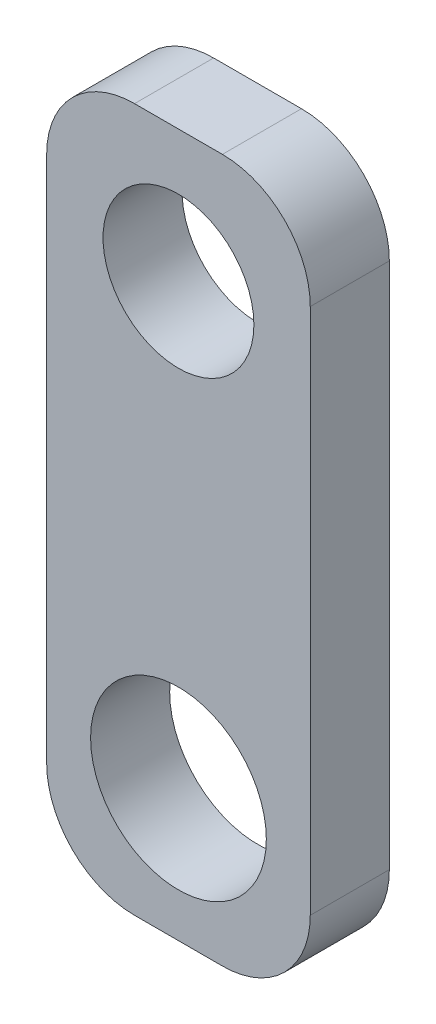
ISO-10303-21;
HEADER;
FILE_DESCRIPTION(('STEP AP214'),'2;1');
FILE_NAME('part.step','',(''),(''),'','','');
FILE_SCHEMA(('AUTOMOTIVE_DESIGN { 1 0 10303 214 1 1 1 1 }'));
ENDSEC;
DATA;
#1=APPLICATION_CONTEXT('core data for automotive mechanical design processes');
#2=APPLICATION_PROTOCOL_DEFINITION('international standard','automotive_design',2000,#1);
#3=PRODUCT_CONTEXT('',#1,'mechanical');
#4=PRODUCT('Part','Part','',(#3));
#5=PRODUCT_RELATED_PRODUCT_CATEGORY('part','',(#4));
#6=PRODUCT_DEFINITION_FORMATION('','',#4);
#7=PRODUCT_DEFINITION_CONTEXT('part definition',#1,'design');
#8=PRODUCT_DEFINITION('design','',#6,#7);
#9=PRODUCT_DEFINITION_SHAPE('','',#8);
#10=(LENGTH_UNIT() NAMED_UNIT(*) SI_UNIT(.MILLI.,.METRE.));
#11=(NAMED_UNIT(*) PLANE_ANGLE_UNIT() SI_UNIT($,.RADIAN.));
#12=(NAMED_UNIT(*) SI_UNIT($,.STERADIAN.) SOLID_ANGLE_UNIT());
#13=UNCERTAINTY_MEASURE_WITH_UNIT(LENGTH_MEASURE(1.E-05),#10,'distance_accuracy_value','');
#14=(GEOMETRIC_REPRESENTATION_CONTEXT(3) GLOBAL_UNCERTAINTY_ASSIGNED_CONTEXT((#13)) GLOBAL_UNIT_ASSIGNED_CONTEXT((#10,
#11,#12)) REPRESENTATION_CONTEXT('',''));
#15=CARTESIAN_POINT('',(0.,0.,0.));
#16=DIRECTION('',(0.,0.,1.));
#17=DIRECTION('',(1.,0.,0.));
#18=AXIS2_PLACEMENT_3D('',#15,#16,#17);
#19=CARTESIAN_POINT('',(12.7,12.7,11.43));
#20=DIRECTION('',(0.,0.,-1.));
#21=DIRECTION('',(-1.,0.,0.));
#22=AXIS2_PLACEMENT_3D('',#19,#20,#21);
#23=PLANE('',#22);
#24=CARTESIAN_POINT('',(12.7,12.7,11.43));
#25=DIRECTION('',(0.,0.,1.));
#26=DIRECTION('',(-1.,0.,0.));
#27=AXIS2_PLACEMENT_3D('',#24,#25,#26);
#28=CIRCLE('',#27,12.7);
#29=CARTESIAN_POINT('',(0.,12.7000000000001,11.43));
#30=VERTEX_POINT('',#29);
#31=CARTESIAN_POINT('',(12.7000000000001,0.,11.43));
#32=VERTEX_POINT('',#31);
#33=EDGE_CURVE('E154',#30,#32,#28,.T.);
#34=ORIENTED_EDGE('',*,*,#33,.T.);
#35=DIRECTION('',(1.,0.,0.));
#36=VECTOR('',#35,1.);
#37=CARTESIAN_POINT('',(12.7000000000001,0.,11.43));
#38=LINE('',#37,#36);
#39=CARTESIAN_POINT('',(25.3999999999999,0.,11.43));
#40=VERTEX_POINT('',#39);
#41=EDGE_CURVE('E104',#32,#40,#38,.T.);
#42=ORIENTED_EDGE('',*,*,#41,.T.);
#43=CARTESIAN_POINT('',(25.4,12.7,11.43));
#44=DIRECTION('',(0.,0.,1.));
#45=DIRECTION('',(1.,0.,0.));
#46=AXIS2_PLACEMENT_3D('',#43,#44,#45);
#47=CIRCLE('',#46,12.7);
#48=CARTESIAN_POINT('',(38.1,12.7,11.43));
#49=VERTEX_POINT('',#48);
#50=EDGE_CURVE('E169',#40,#49,#47,.T.);
#51=ORIENTED_EDGE('',*,*,#50,.T.);
#52=DIRECTION('',(0.,1.,0.));
#53=VECTOR('',#52,1.);
#54=CARTESIAN_POINT('',(38.1,12.7000000000001,11.43));
#55=LINE('',#54,#53);
#56=CARTESIAN_POINT('',(38.1,88.8999999999999,11.43));
#57=VERTEX_POINT('',#56);
#58=EDGE_CURVE('E183',#49,#57,#55,.T.);
#59=ORIENTED_EDGE('',*,*,#58,.T.);
#60=CARTESIAN_POINT('',(25.4,88.9,11.43));
#61=DIRECTION('',(0.,0.,1.));
#62=DIRECTION('',(-1.,0.,0.));
#63=AXIS2_PLACEMENT_3D('',#60,#61,#62);
#64=CIRCLE('',#63,12.7);
#65=CARTESIAN_POINT('',(25.3999999999999,101.6,11.43));
#66=VERTEX_POINT('',#65);
#67=EDGE_CURVE('E122',#57,#66,#64,.T.);
#68=ORIENTED_EDGE('',*,*,#67,.T.);
#69=DIRECTION('',(-1.,0.,0.));
#70=VECTOR('',#69,1.);
#71=CARTESIAN_POINT('',(12.7000000000001,101.6,11.43));
#72=LINE('',#71,#70);
#73=CARTESIAN_POINT('',(12.7000000000001,101.6,11.43));
#74=VERTEX_POINT('',#73);
#75=EDGE_CURVE('E118',#66,#74,#72,.T.);
#76=ORIENTED_EDGE('',*,*,#75,.T.);
#77=CARTESIAN_POINT('',(12.7,88.9,11.43));
#78=DIRECTION('',(0.,0.,1.));
#79=DIRECTION('',(-1.,0.,0.));
#80=AXIS2_PLACEMENT_3D('',#77,#78,#79);
#81=CIRCLE('',#80,12.7);
#82=CARTESIAN_POINT('',(0.,88.8999999999999,11.43));
#83=VERTEX_POINT('',#82);
#84=EDGE_CURVE('E119',#74,#83,#81,.T.);
#85=ORIENTED_EDGE('',*,*,#84,.T.);
#86=DIRECTION('',(0.,-1.,0.));
#87=VECTOR('',#86,1.);
#88=CARTESIAN_POINT('',(0.,12.7000000000001,11.43));
#89=LINE('',#88,#87);
#90=EDGE_CURVE('E58',#83,#30,#89,.T.);
#91=ORIENTED_EDGE('',*,*,#90,.T.);
#92=EDGE_LOOP('',(#34,#42,#51,#59,#68,#76,#85,#91));
#93=FACE_BOUND('',#92,.T.);
#94=CARTESIAN_POINT('',(19.05,82.55,11.43));
#95=DIRECTION('',(0.,0.,1.));
#96=DIRECTION('',(1.,0.,0.));
#97=AXIS2_PLACEMENT_3D('',#94,#95,#96);
#98=CIRCLE('',#97,10.90295);
#99=CARTESIAN_POINT('',(29.95295,82.55,11.43));
#100=VERTEX_POINT('',#99);
#101=EDGE_CURVE('E143',#100,#100,#98,.T.);
#102=ORIENTED_EDGE('',*,*,#101,.F.);
#103=EDGE_LOOP('',(#102));
#104=FACE_BOUND('',#103,.T.);
#105=CARTESIAN_POINT('',(19.05,19.05,11.43));
#106=DIRECTION('',(0.,0.,1.));
#107=DIRECTION('',(1.,0.,0.));
#108=AXIS2_PLACEMENT_3D('',#105,#106,#107);
#109=CIRCLE('',#108,12.7);
#110=CARTESIAN_POINT('',(31.75,19.05,11.43));
#111=VERTEX_POINT('',#110);
#112=EDGE_CURVE('E195',#111,#111,#109,.T.);
#113=ORIENTED_EDGE('',*,*,#112,.F.);
#114=EDGE_LOOP('',(#113));
#115=FACE_BOUND('',#114,.T.);
#116=ADVANCED_FACE('F43',(#93,#104,#115),#23,.F.);
#117=CARTESIAN_POINT('',(12.7,12.7,0.));
#118=DIRECTION('',(0.,0.,-1.));
#119=DIRECTION('',(-1.,0.,0.));
#120=AXIS2_PLACEMENT_3D('',#117,#118,#119);
#121=PLANE('',#120);
#122=CARTESIAN_POINT('',(19.05,82.55,0.));
#123=DIRECTION('',(0.,0.,1.));
#124=DIRECTION('',(1.,0.,0.));
#125=AXIS2_PLACEMENT_3D('',#122,#123,#124);
#126=CIRCLE('',#125,10.90295);
#127=CARTESIAN_POINT('',(29.95295,82.55,0.));
#128=VERTEX_POINT('',#127);
#129=EDGE_CURVE('E188',#128,#128,#126,.T.);
#130=ORIENTED_EDGE('',*,*,#129,.T.);
#131=EDGE_LOOP('',(#130));
#132=FACE_BOUND('',#131,.T.);
#133=CARTESIAN_POINT('',(12.7,12.7,0.));
#134=DIRECTION('',(0.,0.,1.));
#135=DIRECTION('',(-1.,0.,0.));
#136=AXIS2_PLACEMENT_3D('',#133,#134,#135);
#137=CIRCLE('',#136,12.7);
#138=CARTESIAN_POINT('',(0.,12.7000000000001,0.));
#139=VERTEX_POINT('',#138);
#140=CARTESIAN_POINT('',(12.7000000000001,0.,0.));
#141=VERTEX_POINT('',#140);
#142=EDGE_CURVE('E139',#139,#141,#137,.T.);
#143=ORIENTED_EDGE('',*,*,#142,.F.);
#144=DIRECTION('',(0.,-1.,0.));
#145=VECTOR('',#144,1.);
#146=CARTESIAN_POINT('',(0.,12.7000000000001,0.));
#147=LINE('',#146,#145);
#148=CARTESIAN_POINT('',(0.,88.8999999999999,0.));
#149=VERTEX_POINT('',#148);
#150=EDGE_CURVE('E94',#149,#139,#147,.T.);
#151=ORIENTED_EDGE('',*,*,#150,.F.);
#152=CARTESIAN_POINT('',(12.7,88.9,0.));
#153=DIRECTION('',(0.,0.,1.));
#154=DIRECTION('',(-1.,0.,0.));
#155=AXIS2_PLACEMENT_3D('',#152,#153,#154);
#156=CIRCLE('',#155,12.7);
#157=CARTESIAN_POINT('',(12.7000000000001,101.6,0.));
#158=VERTEX_POINT('',#157);
#159=EDGE_CURVE('E87',#158,#149,#156,.T.);
#160=ORIENTED_EDGE('',*,*,#159,.F.);
#161=DIRECTION('',(-1.,0.,0.));
#162=VECTOR('',#161,1.);
#163=CARTESIAN_POINT('',(12.7000000000001,101.6,0.));
#164=LINE('',#163,#162);
#165=CARTESIAN_POINT('',(25.3999999999999,101.6,0.));
#166=VERTEX_POINT('',#165);
#167=EDGE_CURVE('E127',#166,#158,#164,.T.);
#168=ORIENTED_EDGE('',*,*,#167,.F.);
#169=CARTESIAN_POINT('',(25.4,88.9,0.));
#170=DIRECTION('',(0.,0.,1.));
#171=DIRECTION('',(-1.,0.,0.));
#172=AXIS2_PLACEMENT_3D('',#169,#170,#171);
#173=CIRCLE('',#172,12.7);
#174=CARTESIAN_POINT('',(38.1,88.8999999999999,0.));
#175=VERTEX_POINT('',#174);
#176=EDGE_CURVE('E148',#175,#166,#173,.T.);
#177=ORIENTED_EDGE('',*,*,#176,.F.);
#178=DIRECTION('',(0.,1.,0.));
#179=VECTOR('',#178,1.);
#180=CARTESIAN_POINT('',(38.1,12.7000000000001,0.));
#181=LINE('',#180,#179);
#182=CARTESIAN_POINT('',(38.1,12.7,0.));
#183=VERTEX_POINT('',#182);
#184=EDGE_CURVE('E149',#183,#175,#181,.T.);
#185=ORIENTED_EDGE('',*,*,#184,.F.);
#186=CARTESIAN_POINT('',(25.4,12.7,0.));
#187=DIRECTION('',(0.,0.,1.));
#188=DIRECTION('',(1.,0.,0.));
#189=AXIS2_PLACEMENT_3D('',#186,#187,#188);
#190=CIRCLE('',#189,12.7);
#191=CARTESIAN_POINT('',(25.3999999999999,0.,0.));
#192=VERTEX_POINT('',#191);
#193=EDGE_CURVE('E147',#192,#183,#190,.T.);
#194=ORIENTED_EDGE('',*,*,#193,.F.);
#195=DIRECTION('',(1.,0.,0.));
#196=VECTOR('',#195,1.);
#197=CARTESIAN_POINT('',(12.7000000000001,0.,0.));
#198=LINE('',#197,#196);
#199=EDGE_CURVE('E142',#141,#192,#198,.T.);
#200=ORIENTED_EDGE('',*,*,#199,.F.);
#201=EDGE_LOOP('',(#143,#151,#160,#168,#177,#185,#194,#200));
#202=FACE_BOUND('',#201,.T.);
#203=CARTESIAN_POINT('',(19.05,19.05,0.));
#204=DIRECTION('',(0.,0.,1.));
#205=DIRECTION('',(1.,0.,0.));
#206=AXIS2_PLACEMENT_3D('',#203,#204,#205);
#207=CIRCLE('',#206,12.7);
#208=CARTESIAN_POINT('',(31.75,19.05,0.));
#209=VERTEX_POINT('',#208);
#210=EDGE_CURVE('E193',#209,#209,#207,.T.);
#211=ORIENTED_EDGE('',*,*,#210,.T.);
#212=EDGE_LOOP('',(#211));
#213=FACE_BOUND('',#212,.T.);
#214=ADVANCED_FACE('F174',(#132,#202,#213),#121,.T.);
#215=CARTESIAN_POINT('',(12.7,12.7,11.43));
#216=DIRECTION('',(0.,0.,-1.));
#217=DIRECTION('',(-1.,0.,0.));
#218=AXIS2_PLACEMENT_3D('',#215,#216,#217);
#219=CYLINDRICAL_SURFACE('',#218,12.7);
#220=ORIENTED_EDGE('',*,*,#142,.T.);
#221=DIRECTION('',(0.,0.,-1.));
#222=VECTOR('',#221,1.);
#223=CARTESIAN_POINT('',(12.7000000000001,0.,11.43));
#224=LINE('',#223,#222);
#225=EDGE_CURVE('E11',#32,#141,#224,.T.);
#226=ORIENTED_EDGE('',*,*,#225,.F.);
#227=ORIENTED_EDGE('',*,*,#33,.F.);
#228=DIRECTION('',(0.,0.,-1.));
#229=VECTOR('',#228,1.);
#230=CARTESIAN_POINT('',(0.,12.7000000000001,11.43));
#231=LINE('',#230,#229);
#232=EDGE_CURVE('E136',#30,#139,#231,.T.);
#233=ORIENTED_EDGE('',*,*,#232,.T.);
#234=EDGE_LOOP('',(#220,#226,#227,#233));
#235=FACE_BOUND('',#234,.T.);
#236=ADVANCED_FACE('F44',(#235),#219,.T.);
#237=CARTESIAN_POINT('',(12.7000000000001,0.,11.43));
#238=DIRECTION('',(0.,1.,0.));
#239=DIRECTION('',(0.,0.,1.));
#240=AXIS2_PLACEMENT_3D('',#237,#238,#239);
#241=PLANE('',#240);
#242=ORIENTED_EDGE('',*,*,#199,.T.);
#243=DIRECTION('',(0.,0.,-1.));
#244=VECTOR('',#243,1.);
#245=CARTESIAN_POINT('',(25.3999999999999,0.,11.43));
#246=LINE('',#245,#244);
#247=EDGE_CURVE('E55',#40,#192,#246,.T.);
#248=ORIENTED_EDGE('',*,*,#247,.F.);
#249=ORIENTED_EDGE('',*,*,#41,.F.);
#250=ORIENTED_EDGE('',*,*,#225,.T.);
#251=EDGE_LOOP('',(#242,#248,#249,#250));
#252=FACE_BOUND('',#251,.T.);
#253=ADVANCED_FACE('F226',(#252),#241,.F.);
#254=CARTESIAN_POINT('',(25.4,12.7,11.43));
#255=DIRECTION('',(0.,0.,-1.));
#256=DIRECTION('',(-1.,0.,0.));
#257=AXIS2_PLACEMENT_3D('',#254,#255,#256);
#258=CYLINDRICAL_SURFACE('',#257,12.7);
#259=ORIENTED_EDGE('',*,*,#193,.T.);
#260=DIRECTION('',(0.,0.,-1.));
#261=VECTOR('',#260,1.);
#262=CARTESIAN_POINT('',(38.1,12.7,11.43));
#263=LINE('',#262,#261);
#264=EDGE_CURVE('E165',#49,#183,#263,.T.);
#265=ORIENTED_EDGE('',*,*,#264,.F.);
#266=ORIENTED_EDGE('',*,*,#50,.F.);
#267=ORIENTED_EDGE('',*,*,#247,.T.);
#268=EDGE_LOOP('',(#259,#265,#266,#267));
#269=FACE_BOUND('',#268,.T.);
#270=ADVANCED_FACE('F166',(#269),#258,.T.);
#271=CARTESIAN_POINT('',(38.1,12.7000000000001,11.43));
#272=DIRECTION('',(-1.,0.,0.));
#273=DIRECTION('',(0.,-1.,0.));
#274=AXIS2_PLACEMENT_3D('',#271,#272,#273);
#275=PLANE('',#274);
#276=ORIENTED_EDGE('',*,*,#184,.T.);
#277=DIRECTION('',(0.,0.,-1.));
#278=VECTOR('',#277,1.);
#279=CARTESIAN_POINT('',(38.1,88.8999999999999,11.43));
#280=LINE('',#279,#278);
#281=EDGE_CURVE('E159',#57,#175,#280,.T.);
#282=ORIENTED_EDGE('',*,*,#281,.F.);
#283=ORIENTED_EDGE('',*,*,#58,.F.);
#284=ORIENTED_EDGE('',*,*,#264,.T.);
#285=EDGE_LOOP('',(#276,#282,#283,#284));
#286=FACE_BOUND('',#285,.T.);
#287=ADVANCED_FACE('F177',(#286),#275,.F.);
#288=CARTESIAN_POINT('',(25.4,88.9,11.43));
#289=DIRECTION('',(0.,0.,-1.));
#290=DIRECTION('',(-1.,0.,0.));
#291=AXIS2_PLACEMENT_3D('',#288,#289,#290);
#292=CYLINDRICAL_SURFACE('',#291,12.7);
#293=ORIENTED_EDGE('',*,*,#176,.T.);
#294=DIRECTION('',(0.,0.,-1.));
#295=VECTOR('',#294,1.);
#296=CARTESIAN_POINT('',(25.3999999999999,101.6,11.43));
#297=LINE('',#296,#295);
#298=EDGE_CURVE('E131',#66,#166,#297,.T.);
#299=ORIENTED_EDGE('',*,*,#298,.F.);
#300=ORIENTED_EDGE('',*,*,#67,.F.);
#301=ORIENTED_EDGE('',*,*,#281,.T.);
#302=EDGE_LOOP('',(#293,#299,#300,#301));
#303=FACE_BOUND('',#302,.T.);
#304=ADVANCED_FACE('F185',(#303),#292,.T.);
#305=CARTESIAN_POINT('',(12.7000000000001,101.6,11.43));
#306=DIRECTION('',(0.,-1.,0.));
#307=DIRECTION('',(0.,0.,-1.));
#308=AXIS2_PLACEMENT_3D('',#305,#306,#307);
#309=PLANE('',#308);
#310=ORIENTED_EDGE('',*,*,#167,.T.);
#311=DIRECTION('',(0.,0.,-1.));
#312=VECTOR('',#311,1.);
#313=CARTESIAN_POINT('',(12.7000000000001,101.6,11.43));
#314=LINE('',#313,#312);
#315=EDGE_CURVE('E130',#74,#158,#314,.T.);
#316=ORIENTED_EDGE('',*,*,#315,.F.);
#317=ORIENTED_EDGE('',*,*,#75,.F.);
#318=ORIENTED_EDGE('',*,*,#298,.T.);
#319=EDGE_LOOP('',(#310,#316,#317,#318));
#320=FACE_BOUND('',#319,.T.);
#321=ADVANCED_FACE('F126',(#320),#309,.F.);
#322=CARTESIAN_POINT('',(12.7,88.9,11.43));
#323=DIRECTION('',(0.,0.,-1.));
#324=DIRECTION('',(-1.,0.,0.));
#325=AXIS2_PLACEMENT_3D('',#322,#323,#324);
#326=CYLINDRICAL_SURFACE('',#325,12.7);
#327=ORIENTED_EDGE('',*,*,#159,.T.);
#328=DIRECTION('',(0.,0.,-1.));
#329=VECTOR('',#328,1.);
#330=CARTESIAN_POINT('',(0.,88.8999999999999,11.43));
#331=LINE('',#330,#329);
#332=EDGE_CURVE('E135',#83,#149,#331,.T.);
#333=ORIENTED_EDGE('',*,*,#332,.F.);
#334=ORIENTED_EDGE('',*,*,#84,.F.);
#335=ORIENTED_EDGE('',*,*,#315,.T.);
#336=EDGE_LOOP('',(#327,#333,#334,#335));
#337=FACE_BOUND('',#336,.T.);
#338=ADVANCED_FACE('F132',(#337),#326,.T.);
#339=CARTESIAN_POINT('',(0.,12.7000000000001,11.43));
#340=DIRECTION('',(1.,0.,0.));
#341=DIRECTION('',(0.,0.,-1.));
#342=AXIS2_PLACEMENT_3D('',#339,#340,#341);
#343=PLANE('',#342);
#344=ORIENTED_EDGE('',*,*,#150,.T.);
#345=ORIENTED_EDGE('',*,*,#232,.F.);
#346=ORIENTED_EDGE('',*,*,#90,.F.);
#347=ORIENTED_EDGE('',*,*,#332,.T.);
#348=EDGE_LOOP('',(#344,#345,#346,#347));
#349=FACE_BOUND('',#348,.T.);
#350=ADVANCED_FACE('F214',(#349),#343,.F.);
#351=CARTESIAN_POINT('',(19.05,82.55,11.43));
#352=DIRECTION('',(0.,0.,-1.));
#353=DIRECTION('',(-1.,0.,0.));
#354=AXIS2_PLACEMENT_3D('',#351,#352,#353);
#355=CYLINDRICAL_SURFACE('',#354,10.90295);
#356=ORIENTED_EDGE('',*,*,#101,.T.);
#357=EDGE_LOOP('',(#356));
#358=FACE_BOUND('',#357,.T.);
#359=ORIENTED_EDGE('',*,*,#129,.F.);
#360=EDGE_LOOP('',(#359));
#361=FACE_BOUND('',#360,.T.);
#362=ADVANCED_FACE('F212',(#358,#361),#355,.F.);
#363=CARTESIAN_POINT('',(19.05,19.05,11.43));
#364=DIRECTION('',(0.,0.,-1.));
#365=DIRECTION('',(-1.,0.,0.));
#366=AXIS2_PLACEMENT_3D('',#363,#364,#365);
#367=CYLINDRICAL_SURFACE('',#366,12.7);
#368=ORIENTED_EDGE('',*,*,#112,.T.);
#369=EDGE_LOOP('',(#368));
#370=FACE_BOUND('',#369,.T.);
#371=ORIENTED_EDGE('',*,*,#210,.F.);
#372=EDGE_LOOP('',(#371));
#373=FACE_BOUND('',#372,.T.);
#374=ADVANCED_FACE('F202',(#370,#373),#367,.F.);
#375=CLOSED_SHELL('',(#116,#214,#236,#253,#270,#287,#304,#321,#338,#350,#362,#374));
#376=MANIFOLD_SOLID_BREP('B2',#375);
#377=ADVANCED_BREP_SHAPE_REPRESENTATION('',(#18,#376),#14);
#378=SHAPE_DEFINITION_REPRESENTATION(#9,#377);
ENDSEC;
END-ISO-10303-21;
